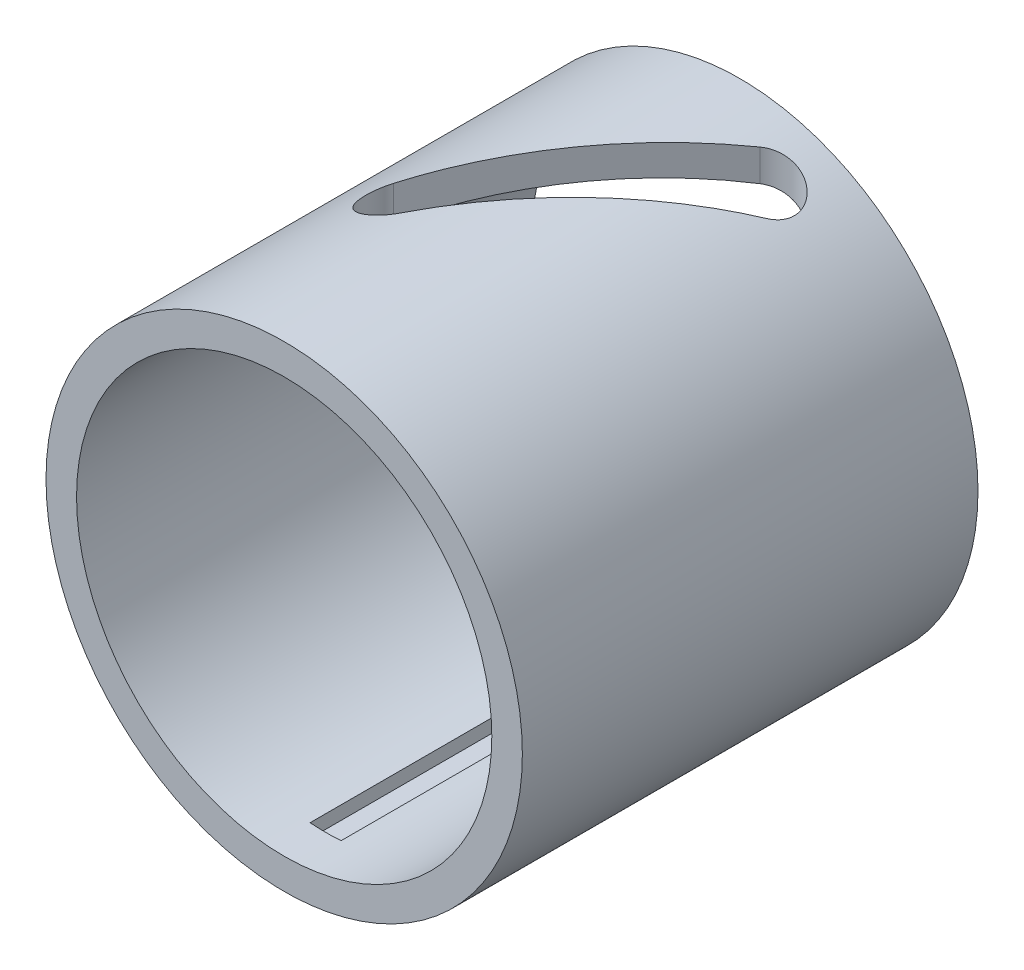
ISO-10303-21;
HEADER;
FILE_DESCRIPTION(('STEP AP214'),'2;1');
FILE_NAME('part.step','',(''),(''),'','','');
FILE_SCHEMA(('AUTOMOTIVE_DESIGN { 1 0 10303 214 1 1 1 1 }'));
ENDSEC;
DATA;
#1=APPLICATION_CONTEXT('core data for automotive mechanical design processes');
#2=APPLICATION_PROTOCOL_DEFINITION('international standard','automotive_design',2000,#1);
#3=PRODUCT_CONTEXT('',#1,'mechanical');
#4=PRODUCT('Part','Part','',(#3));
#5=PRODUCT_RELATED_PRODUCT_CATEGORY('part','',(#4));
#6=PRODUCT_DEFINITION_FORMATION('','',#4);
#7=PRODUCT_DEFINITION_CONTEXT('part definition',#1,'design');
#8=PRODUCT_DEFINITION('design','',#6,#7);
#9=PRODUCT_DEFINITION_SHAPE('','',#8);
#10=(LENGTH_UNIT() NAMED_UNIT(*) SI_UNIT(.MILLI.,.METRE.));
#11=(NAMED_UNIT(*) PLANE_ANGLE_UNIT() SI_UNIT($,.RADIAN.));
#12=(NAMED_UNIT(*) SI_UNIT($,.STERADIAN.) SOLID_ANGLE_UNIT());
#13=UNCERTAINTY_MEASURE_WITH_UNIT(LENGTH_MEASURE(1.E-05),#10,'distance_accuracy_value','');
#14=(GEOMETRIC_REPRESENTATION_CONTEXT(3) GLOBAL_UNCERTAINTY_ASSIGNED_CONTEXT((#13)) GLOBAL_UNIT_ASSIGNED_CONTEXT((#10,
#11,#12)) REPRESENTATION_CONTEXT('',''));
#15=CARTESIAN_POINT('',(0.,0.,0.));
#16=DIRECTION('',(0.,0.,1.));
#17=DIRECTION('',(1.,0.,0.));
#18=AXIS2_PLACEMENT_3D('',#15,#16,#17);
#19=CARTESIAN_POINT('',(0.,0.,44.));
#20=DIRECTION('',(0.,0.,-1.));
#21=DIRECTION('',(-1.,0.,0.));
#22=AXIS2_PLACEMENT_3D('',#19,#20,#21);
#23=CYLINDRICAL_SURFACE('',#22,20.05);
#24=CARTESIAN_POINT('',(0.,0.,44.));
#25=DIRECTION('',(0.,0.,1.));
#26=DIRECTION('',(1.,0.,0.));
#27=AXIS2_PLACEMENT_3D('',#24,#25,#26);
#28=CIRCLE('',#27,20.05);
#29=CARTESIAN_POINT('',(20.05,0.,44.));
#30=VERTEX_POINT('',#29);
#31=EDGE_CURVE('E193',#30,#30,#28,.T.);
#32=ORIENTED_EDGE('',*,*,#31,.T.);
#33=EDGE_LOOP('',(#32));
#34=FACE_BOUND('',#33,.T.);
#35=CARTESIAN_POINT('',(0.,0.,10.8478283437514));
#36=DIRECTION('',(0.756779205053716,0.,0.653670585844481));
#37=DIRECTION('',(0.653670585844481,0.,-0.756779205053716));
#38=AXIS2_PLACEMENT_3D('',#35,#36,#37);
#39=ELLIPSE('',#38,30.672942050922,20.05);
#40=CARTESIAN_POINT('',(5.93030233251377,19.1529113777771,3.98209263203964));
#41=VERTEX_POINT('',#40);
#42=CARTESIAN_POINT('',(-10.4709775628361,17.0985709601295,22.9704758174801));
#43=VERTEX_POINT('',#42);
#44=EDGE_CURVE('E171',#41,#43,#39,.T.);
#45=ORIENTED_EDGE('',*,*,#44,.T.);
#46=CARTESIAN_POINT('',(-10.4709775628361,17.0985709601295,22.9704758174801));
#47=CARTESIAN_POINT('',(-10.5203251715778,17.0683518600135,23.0276123028475));
#48=CARTESIAN_POINT('',(-10.5677396584952,17.0390209666357,23.0868628434022));
#49=CARTESIAN_POINT('',(-10.6583947564328,16.9824607441501,23.2094922146929));
#50=CARTESIAN_POINT('',(-10.7016323361369,16.9552329441547,23.2728739885555));
#51=CARTESIAN_POINT('',(-10.8249185600983,16.877000140305,23.4695823044986));
#52=CARTESIAN_POINT('',(-10.8980468059648,16.8297508635353,23.6089054553306));
#53=CARTESIAN_POINT('',(-11.0227523826062,16.7483456249599,23.9014314450786));
#54=CARTESIAN_POINT('',(-11.0742296069965,16.7142505420525,24.0546948562874));
#55=CARTESIAN_POINT('',(-11.1325711958885,16.6753974494036,24.2908879198746));
#56=CARTESIAN_POINT('',(-11.1488661865684,16.6644991762403,24.3705905133884));
#57=CARTESIAN_POINT('',(-11.174973944022,16.6470027686931,24.5315098998687));
#58=CARTESIAN_POINT('',(-11.1847873416341,16.6404042158283,24.6127265446847));
#59=CARTESIAN_POINT('',(-11.2029042945556,16.6282201462565,24.8414415409647));
#60=CARTESIAN_POINT('',(-11.2036981894854,16.6276823926632,24.989908073002));
#61=CARTESIAN_POINT('',(-11.1834483996578,16.6413071857435,25.2846493538103));
#62=CARTESIAN_POINT('',(-11.1623929168516,16.6554776744548,25.4309228751307));
#63=CARTESIAN_POINT('',(-11.1011745449738,16.6963374186882,25.7101878634728));
#64=CARTESIAN_POINT('',(-11.061954964607,16.7224078112492,25.8434804960682));
#65=CARTESIAN_POINT('',(-10.966631631379,16.7850745261113,26.1011813017534));
#66=CARTESIAN_POINT('',(-10.9105267775071,16.8216715347975,26.2255888948362));
#67=CARTESIAN_POINT('',(-10.7777967953571,16.9070500857724,26.4741652984793));
#68=CARTESIAN_POINT('',(-10.6997838735485,16.9566293382752,26.5973148201328));
#69=CARTESIAN_POINT('',(-10.5287534936932,17.0633530434454,26.8290274641264));
#70=CARTESIAN_POINT('',(-10.4357273927665,17.1205018503828,26.9375821180186));
#71=CARTESIAN_POINT('',(-10.2215554399939,17.2493538007786,27.1546859613682));
#72=CARTESIAN_POINT('',(-10.0982861493416,17.3219391345176,27.2606185148612));
#73=CARTESIAN_POINT('',(-9.83796456813808,17.4711048165308,27.4504471174158));
#74=CARTESIAN_POINT('',(-9.70090432684117,17.5476874569435,27.5343303527988));
#75=CARTESIAN_POINT('',(-9.39729136449156,17.7123372630864,27.6884086374601));
#76=CARTESIAN_POINT('',(-9.22921920359592,17.8006055602511,27.7554166818427));
#77=CARTESIAN_POINT('',(-8.88314209237513,17.9758164007182,27.8584019254089));
#78=CARTESIAN_POINT('',(-8.70513372321974,18.0627584744309,27.8943683729143));
#79=CARTESIAN_POINT('',(-8.3370833077581,18.2356282060896,27.9342781050479));
#80=CARTESIAN_POINT('',(-8.14683821346287,18.3214127526273,27.9370511645556));
#81=CARTESIAN_POINT('',(-7.86161085245654,18.4447402799961,27.913802806005));
#82=CARTESIAN_POINT('',(-7.76650536079663,18.4849788861642,27.9014708015325));
#83=CARTESIAN_POINT('',(-7.57712204406956,18.5634097171876,27.8675496604315));
#84=CARTESIAN_POINT('',(-7.48284381694852,18.6016029880873,27.8459653075829));
#85=CARTESIAN_POINT('',(-7.30106737670624,18.6736702905207,27.7949113396421));
#86=CARTESIAN_POINT('',(-7.2134789333852,18.7076662415949,27.7659333762081));
#87=CARTESIAN_POINT('',(-7.04065787790705,18.7733900905166,27.6996997663138));
#88=CARTESIAN_POINT('',(-6.95542410541423,18.805119118144,27.6624482817512));
#89=CARTESIAN_POINT('',(-6.78819858584106,18.8661276800203,27.5798259117999));
#90=CARTESIAN_POINT('',(-6.7062032759908,18.8954099480107,27.5344642707371));
#91=CARTESIAN_POINT('',(-6.54623755467705,18.9514236319261,27.4358401758082));
#92=CARTESIAN_POINT('',(-6.46826552048024,18.9781560800366,27.3825809414416));
#93=CARTESIAN_POINT('',(-6.3089209413293,19.0317581381685,27.2622400787994));
#94=CARTESIAN_POINT('',(-6.22810360639089,19.0583253082718,27.1942846672439));
#95=CARTESIAN_POINT('',(-6.07359491606944,19.1081287239675,27.0497214696143));
#96=CARTESIAN_POINT('',(-5.99989900399502,19.1313671041632,26.9731192851951));
#97=CARTESIAN_POINT('',(-5.93030233251377,19.1529113777771,26.892499332547));
#98=B_SPLINE_CURVE_WITH_KNOTS('',3,(#46,#47,#48,#49,#50,#51,#52,#53,#54,#55,#56,#57,#58,#59,#60,
#61,#62,#63,#64,#65,#66,#67,#68,#69,#70,#71,#72,#73,#74,#75,#76,#77,#78,#79,#80,#81,#82,#83,#84,
#85,#86,#87,#88,#89,#90,#91,#92,#93,#94,#95,#96,#97),.UNSPECIFIED.,.F.,.F.,(4,2,2,2,2,2,2,2,2,2,
2,2,2,2,2,2,2,2,2,2,2,2,2,2,2,4),(0.,0.243859018644434,0.487893704639131,0.978369218654151,
1.47108822391796,1.7169845932974,1.96285702662597,2.40573021982784,2.84884267658316,
3.27115513680617,3.69349514004102,4.15366049594782,4.61409171392185,5.14599589484831,
5.67820850507549,6.27945743572553,6.88091453362177,7.50351587026562,7.81516489524781,
8.12665298102852,8.42123211559666,8.71566339987046,9.00976119308319,9.30373942356481,
9.62975003512143,9.95555064577611),.UNSPECIFIED.);
#99=CARTESIAN_POINT('',(-5.93030233251377,19.1529113777771,26.892499332547));
#100=VERTEX_POINT('',#99);
#101=EDGE_CURVE('E183',#43,#100,#98,.T.);
#102=ORIENTED_EDGE('',*,*,#101,.T.);
#103=CARTESIAN_POINT('',(0.,0.,20.0267636208353));
#104=DIRECTION('',(-0.756779205053716,0.,-0.653670585844481));
#105=DIRECTION('',(0.653670585844481,0.,-0.756779205053716));
#106=AXIS2_PLACEMENT_3D('',#103,#104,#105);
#107=ELLIPSE('',#106,30.672942050922,20.05);
#108=CARTESIAN_POINT('',(10.4709775628361,17.0985709601295,7.90411614710653));
#109=VERTEX_POINT('',#108);
#110=EDGE_CURVE('E170',#100,#109,#107,.T.);
#111=ORIENTED_EDGE('',*,*,#110,.T.);
#112=CARTESIAN_POINT('',(10.4709775628361,17.0985709601295,7.90411614710653));
#113=CARTESIAN_POINT('',(10.5203251715778,17.0683518600135,7.84697966173917));
#114=CARTESIAN_POINT('',(10.5677396584952,17.0390209666357,7.78772912118442));
#115=CARTESIAN_POINT('',(10.6583947564328,16.9824607441501,7.66509974989369));
#116=CARTESIAN_POINT('',(10.7016323361369,16.9552329441547,7.60171797603111));
#117=CARTESIAN_POINT('',(10.8249185600983,16.877000140305,7.40500966008806));
#118=CARTESIAN_POINT('',(10.8980468059648,16.8297508635353,7.26568650925601));
#119=CARTESIAN_POINT('',(11.0227523826062,16.7483456249599,6.97316051950804));
#120=CARTESIAN_POINT('',(11.0742296069965,16.7142505420525,6.81989710829924));
#121=CARTESIAN_POINT('',(11.1325711958885,16.6753974494036,6.58370404471203));
#122=CARTESIAN_POINT('',(11.1488661865684,16.6644991762403,6.50400145119827));
#123=CARTESIAN_POINT('',(11.174973944022,16.6470027686931,6.34308206471796));
#124=CARTESIAN_POINT('',(11.1847873416341,16.6404042158283,6.26186541990188));
#125=CARTESIAN_POINT('',(11.2029042945556,16.6282201462565,6.03315042362188));
#126=CARTESIAN_POINT('',(11.2036981894854,16.6276823926632,5.88468389158467));
#127=CARTESIAN_POINT('',(11.1834483996578,16.6413071857435,5.58994261077628));
#128=CARTESIAN_POINT('',(11.1623929168516,16.6554776744548,5.44366908945592));
#129=CARTESIAN_POINT('',(11.1011745449738,16.6963374186882,5.16440410111383));
#130=CARTESIAN_POINT('',(11.061954964607,16.7224078112492,5.03111146851842));
#131=CARTESIAN_POINT('',(10.966631631379,16.7850745261113,4.7734106628332));
#132=CARTESIAN_POINT('',(10.9105267775071,16.8216715347975,4.64900306975046));
#133=CARTESIAN_POINT('',(10.7777967953571,16.9070500857724,4.40042666610731));
#134=CARTESIAN_POINT('',(10.6997838735485,16.9566293382752,4.27727714445385));
#135=CARTESIAN_POINT('',(10.5287534936933,17.0633530434454,4.04556450046021));
#136=CARTESIAN_POINT('',(10.4357273927665,17.1205018503828,3.93700984656799));
#137=CARTESIAN_POINT('',(10.2215554399939,17.2493538007786,3.71990600321847));
#138=CARTESIAN_POINT('',(10.0982861493416,17.3219391345176,3.61397344972539));
#139=CARTESIAN_POINT('',(9.8379645681381,17.4711048165308,3.42414484717079));
#140=CARTESIAN_POINT('',(9.70090432684118,17.5476874569435,3.34026161178784));
#141=CARTESIAN_POINT('',(9.39729136449157,17.7123372630863,3.18618332712651));
#142=CARTESIAN_POINT('',(9.22921920359594,17.8006055602511,3.11917528274391));
#143=CARTESIAN_POINT('',(8.88314209237514,17.9758164007181,3.01619003917772));
#144=CARTESIAN_POINT('',(8.70513372321975,18.0627584744309,2.98022359167235));
#145=CARTESIAN_POINT('',(8.33708330775811,18.2356282060896,2.94031385953874));
#146=CARTESIAN_POINT('',(8.14683821346289,18.3214127526273,2.937540800031));
#147=CARTESIAN_POINT('',(7.86161085245656,18.4447402799961,2.96078915858166));
#148=CARTESIAN_POINT('',(7.76650536079665,18.4849788861642,2.97312116305408));
#149=CARTESIAN_POINT('',(7.57712204406957,18.5634097171876,3.00704230415515));
#150=CARTESIAN_POINT('',(7.48284381694854,18.6016029880873,3.02862665700376));
#151=CARTESIAN_POINT('',(7.30106737670625,18.6736702905207,3.07968062494453));
#152=CARTESIAN_POINT('',(7.21347893338521,18.7076662415949,3.10865858837855));
#153=CARTESIAN_POINT('',(7.04065787790707,18.7733900905166,3.17489219827287));
#154=CARTESIAN_POINT('',(6.95542410541424,18.805119118144,3.21214368283546));
#155=CARTESIAN_POINT('',(6.78819858584107,18.8661276800203,3.29476605278667));
#156=CARTESIAN_POINT('',(6.70620327599081,18.8954099480107,3.34012769384956));
#157=CARTESIAN_POINT('',(6.54623755467706,18.9514236319261,3.4387517887784));
#158=CARTESIAN_POINT('',(6.46826552048025,18.9781560800366,3.49201102314498));
#159=CARTESIAN_POINT('',(6.30892094132931,19.0317581381685,3.61235188578722));
#160=CARTESIAN_POINT('',(6.2281036063909,19.0583253082718,3.68030729734268));
#161=CARTESIAN_POINT('',(6.07359491606945,19.1081287239675,3.82487049497234));
#162=CARTESIAN_POINT('',(5.99989900399502,19.1313671041632,3.90147267939154));
#163=CARTESIAN_POINT('',(5.93030233251378,19.1529113777771,3.98209263203964));
#164=B_SPLINE_CURVE_WITH_KNOTS('',3,(#112,#113,#114,#115,#116,#117,#118,#119,#120,#121,#122,
#123,#124,#125,#126,#127,#128,#129,#130,#131,#132,#133,#134,#135,#136,#137,#138,#139,#140,#141,
#142,#143,#144,#145,#146,#147,#148,#149,#150,#151,#152,#153,#154,#155,#156,#157,#158,#159,#160,
#161,#162,#163),.UNSPECIFIED.,.F.,.F.,(4,2,2,2,2,2,2,2,2,2,2,2,2,2,2,2,2,2,2,2,2,2,2,2,2,4),(0.,
0.243859018644437,0.487893704639133,0.978369218654152,1.47108822391796,1.7169845932974,
1.96285702662598,2.40573021982785,2.84884267658317,3.27115513680617,3.69349514004102,
4.15366049594783,4.61409171392186,5.14599589484831,5.67820850507549,6.27945743572553,
6.88091453362177,7.50351587026562,7.81516489524781,8.12665298102853,8.42123211559666,
8.71566339987047,9.00976119308319,9.30373942356482,9.62975003512144,9.95555064577612),.UNSPECIFIED.);
#165=EDGE_CURVE('E162',#109,#41,#164,.T.);
#166=ORIENTED_EDGE('',*,*,#165,.T.);
#167=EDGE_LOOP('',(#45,#102,#111,#166));
#168=FACE_BOUND('',#167,.T.);
#169=CARTESIAN_POINT('',(0.,0.,0.));
#170=DIRECTION('',(0.,0.,1.));
#171=DIRECTION('',(1.,0.,0.));
#172=AXIS2_PLACEMENT_3D('',#169,#170,#171);
#173=CIRCLE('',#172,20.05);
#174=CARTESIAN_POINT('',(1.5,-19.9938115425749,0.));
#175=VERTEX_POINT('',#174);
#176=CARTESIAN_POINT('',(-1.5,-19.9938115425749,0.));
#177=VERTEX_POINT('',#176);
#178=EDGE_CURVE('E192',#175,#177,#173,.T.);
#179=ORIENTED_EDGE('',*,*,#178,.F.);
#180=DIRECTION('',(0.,0.,-1.));
#181=VECTOR('',#180,1.);
#182=CARTESIAN_POINT('',(1.5,-19.9938115425749,44.));
#183=LINE('',#182,#181);
#184=CARTESIAN_POINT('',(1.5,-19.9938115425749,40.));
#185=VERTEX_POINT('',#184);
#186=EDGE_CURVE('E128',#175,#185,#183,.F.);
#187=ORIENTED_EDGE('',*,*,#186,.T.);
#188=CARTESIAN_POINT('',(0.,0.,40.));
#189=DIRECTION('',(0.,0.,-1.));
#190=DIRECTION('',(-1.,0.,0.));
#191=AXIS2_PLACEMENT_3D('',#188,#189,#190);
#192=CIRCLE('',#191,20.05);
#193=CARTESIAN_POINT('',(-1.5,-19.9938115425749,40.));
#194=VERTEX_POINT('',#193);
#195=EDGE_CURVE('E11',#185,#194,#192,.T.);
#196=ORIENTED_EDGE('',*,*,#195,.T.);
#197=DIRECTION('',(0.,0.,-1.));
#198=VECTOR('',#197,1.);
#199=CARTESIAN_POINT('',(-1.5,-19.9938115425749,44.));
#200=LINE('',#199,#198);
#201=EDGE_CURVE('E105',#194,#177,#200,.T.);
#202=ORIENTED_EDGE('',*,*,#201,.T.);
#203=EDGE_LOOP('',(#179,#187,#196,#202));
#204=FACE_BOUND('',#203,.T.);
#205=ADVANCED_FACE('F33',(#34,#168,#204),#23,.F.);
#206=CARTESIAN_POINT('',(0.,0.,0.));
#207=DIRECTION('',(0.,0.,1.));
#208=DIRECTION('',(1.,0.,0.));
#209=AXIS2_PLACEMENT_3D('',#206,#207,#208);
#210=PLANE('',#209);
#211=CARTESIAN_POINT('',(0.,0.,0.));
#212=DIRECTION('',(0.,0.,1.));
#213=DIRECTION('',(1.,0.,0.));
#214=AXIS2_PLACEMENT_3D('',#211,#212,#213);
#215=CIRCLE('',#214,23.);
#216=CARTESIAN_POINT('',(23.,0.,0.));
#217=VERTEX_POINT('',#216);
#218=EDGE_CURVE('E197',#217,#217,#215,.T.);
#219=ORIENTED_EDGE('',*,*,#218,.F.);
#220=EDGE_LOOP('',(#219));
#221=FACE_BOUND('',#220,.T.);
#222=DIRECTION('',(0.,1.,0.));
#223=VECTOR('',#222,1.);
#224=CARTESIAN_POINT('',(1.5,-21.3,0.));
#225=LINE('',#224,#223);
#226=CARTESIAN_POINT('',(1.5,-21.3,0.));
#227=VERTEX_POINT('',#226);
#228=EDGE_CURVE('E49',#227,#175,#225,.T.);
#229=ORIENTED_EDGE('',*,*,#228,.T.);
#230=ORIENTED_EDGE('',*,*,#178,.T.);
#231=DIRECTION('',(0.,1.,0.));
#232=VECTOR('',#231,1.);
#233=CARTESIAN_POINT('',(-1.5,0.,0.));
#234=LINE('',#233,#232);
#235=CARTESIAN_POINT('',(-1.5,-21.3,0.));
#236=VERTEX_POINT('',#235);
#237=EDGE_CURVE('E42',#236,#177,#234,.T.);
#238=ORIENTED_EDGE('',*,*,#237,.F.);
#239=DIRECTION('',(1.,0.,0.));
#240=VECTOR('',#239,1.);
#241=CARTESIAN_POINT('',(-1.5,-21.3,0.));
#242=LINE('',#241,#240);
#243=EDGE_CURVE('E114',#236,#227,#242,.T.);
#244=ORIENTED_EDGE('',*,*,#243,.T.);
#245=EDGE_LOOP('',(#229,#230,#238,#244));
#246=FACE_BOUND('',#245,.T.);
#247=ADVANCED_FACE('F177',(#221,#246),#210,.F.);
#248=CARTESIAN_POINT('',(0.,0.,44.));
#249=DIRECTION('',(0.,0.,-1.));
#250=DIRECTION('',(-1.,0.,0.));
#251=AXIS2_PLACEMENT_3D('',#248,#249,#250);
#252=CYLINDRICAL_SURFACE('',#251,23.);
#253=ORIENTED_EDGE('',*,*,#218,.T.);
#254=EDGE_LOOP('',(#253));
#255=FACE_BOUND('',#254,.T.);
#256=CARTESIAN_POINT('',(0.,0.,44.));
#257=DIRECTION('',(0.,0.,1.));
#258=DIRECTION('',(1.,0.,0.));
#259=AXIS2_PLACEMENT_3D('',#256,#257,#258);
#260=CIRCLE('',#259,23.);
#261=CARTESIAN_POINT('',(23.,0.,44.));
#262=VERTEX_POINT('',#261);
#263=EDGE_CURVE('E200',#262,#262,#260,.T.);
#264=ORIENTED_EDGE('',*,*,#263,.F.);
#265=EDGE_LOOP('',(#264));
#266=FACE_BOUND('',#265,.T.);
#267=CARTESIAN_POINT('',(-10.4709775628361,20.4782477003913,22.9704758174801));
#268=CARTESIAN_POINT('',(-10.5216933489736,20.4523161016633,23.029197208829));
#269=CARTESIAN_POINT('',(-10.5703009359283,20.4272237531741,23.0900747332213));
#270=CARTESIAN_POINT('',(-10.662981821202,20.3789976273674,23.2159707916252));
#271=CARTESIAN_POINT('',(-10.707052709194,20.3558648923272,23.2809914974933));
#272=CARTESIAN_POINT('',(-10.8321370809536,20.2897443351438,23.4822870068867));
#273=CARTESIAN_POINT('',(-10.9057361274554,20.2501817772265,23.6244662020593));
#274=CARTESIAN_POINT('',(-11.0301760554913,20.1826731444027,23.9216477468732));
#275=CARTESIAN_POINT('',(-11.0809374264601,20.1547676780081,24.076692704615));
#276=CARTESIAN_POINT('',(-11.1566918957679,20.1129345404651,24.3945117465327));
#277=CARTESIAN_POINT('',(-11.1817402890325,20.0989768767426,24.5572684543969));
#278=CARTESIAN_POINT('',(-11.2039641993443,20.0865956258391,24.8735064192824));
#279=CARTESIAN_POINT('',(-11.2030050498001,20.0871324417345,25.0268185434398));
#280=CARTESIAN_POINT('',(-11.1778358641959,20.1011489364019,25.3309798301754));
#281=CARTESIAN_POINT('',(-11.1536161218092,20.1146340183074,25.4818279378276));
#282=CARTESIAN_POINT('',(-11.0841821762107,20.152974928484,25.7722158518303));
#283=CARTESIAN_POINT('',(-11.0396134591217,20.1774808322306,25.9119585144175));
#284=CARTESIAN_POINT('',(-10.9315892633147,20.2362080732125,26.1817025620406));
#285=CARTESIAN_POINT('',(-10.8681325097891,20.2704300662071,26.311703288824));
#286=CARTESIAN_POINT('',(-10.7195232101655,20.349431441716,26.5681585080753));
#287=CARTESIAN_POINT('',(-10.6331697494972,20.3947790678279,26.6937393246387));
#288=CARTESIAN_POINT('',(-10.444092516966,20.4922484023868,26.9289151855086));
#289=CARTESIAN_POINT('',(-10.3413607537429,20.5443734153787,27.038502375892));
#290=CARTESIAN_POINT('',(-10.109509697135,20.6595352204707,27.2517865579422));
#291=CARTESIAN_POINT('',(-9.97871458199763,20.7231375592366,27.3533581984711));
#292=CARTESIAN_POINT('',(-9.70337598602932,20.8534822034451,27.5331895202454));
#293=CARTESIAN_POINT('',(-9.55882637488675,20.9202259022157,27.6114387419914));
#294=CARTESIAN_POINT('',(-9.24575641482212,21.0605777183552,27.7492038762734));
#295=CARTESIAN_POINT('',(-9.07624899512261,21.1342644306343,27.8064090564046));
#296=CARTESIAN_POINT('',(-8.72908439599452,21.2800032494132,27.8899727986438));
#297=CARTESIAN_POINT('',(-8.55142568914597,21.3520550457446,27.9163255547702));
#298=CARTESIAN_POINT('',(-8.18949758873681,21.4934989570384,27.9370295103008));
#299=CARTESIAN_POINT('',(-8.0051668560311,21.562821602326,27.9308071630796));
#300=CARTESIAN_POINT('',(-7.6386267627921,21.6953767097845,27.8841604720372));
#301=CARTESIAN_POINT('',(-7.45641722082899,21.7586096962313,27.8437390754462));
#302=CARTESIAN_POINT('',(-7.10818773498001,21.8747760701716,27.7312146513382));
#303=CARTESIAN_POINT('',(-6.94180818575916,21.9280410031262,27.6605897063336));
#304=CARTESIAN_POINT('',(-6.70269760047383,22.0018380274415,27.5323301789675));
#305=CARTESIAN_POINT('',(-6.62474707652983,22.0254175167107,27.4858644807633));
#306=CARTESIAN_POINT('',(-6.47297630397109,22.0704966054348,27.3857546339428));
#307=CARTESIAN_POINT('',(-6.39915432933954,22.0919970768442,27.3321135174422));
#308=CARTESIAN_POINT('',(-6.25613726906997,22.1329234390614,27.2178192542061));
#309=CARTESIAN_POINT('',(-6.18695746007338,22.1523425948647,27.1571445918868));
#310=CARTESIAN_POINT('',(-6.05425032566043,22.1889793509901,27.0294632899326));
#311=CARTESIAN_POINT('',(-5.99071606131643,22.2061996656124,26.9624646380864));
#312=CARTESIAN_POINT('',(-5.93030233251377,22.2223201814073,26.892499332547));
#313=B_SPLINE_CURVE_WITH_KNOTS('',3,(#267,#268,#269,#270,#271,#272,#273,#274,#275,#276,#277,
#278,#279,#280,#281,#282,#283,#284,#285,#286,#287,#288,#289,#290,#291,#292,#293,#294,#295,#296,
#297,#298,#299,#300,#301,#302,#303,#304,#305,#306,#307,#308,#309,#310,#311,#312),.UNSPECIFIED.,
.F.,.F.,(4,2,2,2,2,2,2,2,2,2,2,2,2,2,2,2,2,2,2,2,2,2,4),(0.,0.245308598046165,0.490746861947432,
0.982988573590146,1.47693103432992,1.96980904838986,2.42743661765847,2.88525523165414,
3.32946466083193,3.77370407777009,4.24880326471548,4.72413497723539,5.25410977337282,
5.78432189304616,6.36210624296025,6.93999930609493,7.5281011255113,8.1161522682296,
8.67823180794868,8.95919523620433,9.24004031063721,9.521768361526,9.80314520776706),.UNSPECIFIED.);
#314=CARTESIAN_POINT('',(-10.4709775628361,20.4782477003913,22.9704758174801));
#315=VERTEX_POINT('',#314);
#316=CARTESIAN_POINT('',(-5.93030233251377,22.2223201814073,26.892499332547));
#317=VERTEX_POINT('',#316);
#318=EDGE_CURVE('E194',#315,#317,#313,.T.);
#319=ORIENTED_EDGE('',*,*,#318,.F.);
#320=CARTESIAN_POINT('',(0.,0.,10.8478283437514));
#321=DIRECTION('',(0.756779205053716,0.,0.653670585844481));
#322=DIRECTION('',(0.653670585844481,0.,-0.756779205053716));
#323=AXIS2_PLACEMENT_3D('',#320,#321,#322);
#324=ELLIPSE('',#323,35.1859185621549,23.);
#325=CARTESIAN_POINT('',(5.93030233251377,22.2223201814073,3.98209263203964));
#326=VERTEX_POINT('',#325);
#327=EDGE_CURVE('E140',#326,#315,#324,.T.);
#328=ORIENTED_EDGE('',*,*,#327,.F.);
#329=CARTESIAN_POINT('',(10.4709775628361,20.4782477003913,7.90411614710653));
#330=CARTESIAN_POINT('',(10.5216933489736,20.4523161016633,7.84539475575765));
#331=CARTESIAN_POINT('',(10.5703009359283,20.4272237531741,7.78451723136536));
#332=CARTESIAN_POINT('',(10.662981821202,20.3789976273674,7.65862117296145));
#333=CARTESIAN_POINT('',(10.707052709194,20.3558648923272,7.59360046709337));
#334=CARTESIAN_POINT('',(10.8321370809536,20.2897443351438,7.39230495769995));
#335=CARTESIAN_POINT('',(10.9057361274554,20.2501817772265,7.25012576252731));
#336=CARTESIAN_POINT('',(11.0301760554913,20.1826731444027,6.95294421771344));
#337=CARTESIAN_POINT('',(11.0809374264601,20.1547676780081,6.79789925997159));
#338=CARTESIAN_POINT('',(11.1566918957679,20.1129345404651,6.48008021805391));
#339=CARTESIAN_POINT('',(11.1817402890325,20.0989768767426,6.31732351018972));
#340=CARTESIAN_POINT('',(11.2039641993443,20.0865956258391,6.0010855453042));
#341=CARTESIAN_POINT('',(11.2030050498001,20.0871324417345,5.84777342114678));
#342=CARTESIAN_POINT('',(11.1778358641959,20.1011489364019,5.54361213441118));
#343=CARTESIAN_POINT('',(11.1536161218092,20.1146340183074,5.39276402675903));
#344=CARTESIAN_POINT('',(11.0841821762107,20.152974928484,5.10237611275627));
#345=CARTESIAN_POINT('',(11.0396134591218,20.1774808322306,4.96263345016911));
#346=CARTESIAN_POINT('',(10.9315892633147,20.2362080732125,4.69288940254603));
#347=CARTESIAN_POINT('',(10.8681325097891,20.2704300662071,4.56288867576267));
#348=CARTESIAN_POINT('',(10.7195232101655,20.349431441716,4.30643345651131));
#349=CARTESIAN_POINT('',(10.6331697494972,20.3947790678279,4.18085263994789));
#350=CARTESIAN_POINT('',(10.444092516966,20.4922484023868,3.94567677907801));
#351=CARTESIAN_POINT('',(10.3413607537429,20.5443734153787,3.83608958869462));
#352=CARTESIAN_POINT('',(10.109509697135,20.6595352204707,3.62280540664438));
#353=CARTESIAN_POINT('',(9.97871458199764,20.7231375592366,3.52123376611548));
#354=CARTESIAN_POINT('',(9.70337598602933,20.853482203445,3.34140244434124));
#355=CARTESIAN_POINT('',(9.55882637488676,20.9202259022157,3.26315322259521));
#356=CARTESIAN_POINT('',(9.24575641482213,21.0605777183552,3.12538808831321));
#357=CARTESIAN_POINT('',(9.07624899512262,21.1342644306343,3.06818290818198));
#358=CARTESIAN_POINT('',(8.72908439599453,21.2800032494132,2.98461916594277));
#359=CARTESIAN_POINT('',(8.55142568914598,21.3520550457446,2.95826640981642));
#360=CARTESIAN_POINT('',(8.18949758873682,21.4934989570384,2.9375624542858));
#361=CARTESIAN_POINT('',(8.00516685603112,21.562821602326,2.94378480150706));
#362=CARTESIAN_POINT('',(7.63862676279211,21.6953767097845,2.99043149254943));
#363=CARTESIAN_POINT('',(7.456417220829,21.7586096962313,3.03085288914037));
#364=CARTESIAN_POINT('',(7.10818773498002,21.8747760701716,3.14337731324844));
#365=CARTESIAN_POINT('',(6.94180818575917,21.9280410031262,3.21400225825298));
#366=CARTESIAN_POINT('',(6.70269760047384,22.0018380274415,3.34226178561917));
#367=CARTESIAN_POINT('',(6.62474707652984,22.0254175167107,3.38872748382334));
#368=CARTESIAN_POINT('',(6.4729763039711,22.0704966054348,3.48883733064385));
#369=CARTESIAN_POINT('',(6.39915432933955,22.0919970768442,3.54247844714445));
#370=CARTESIAN_POINT('',(6.25613726906998,22.1329234390614,3.6567727103805));
#371=CARTESIAN_POINT('',(6.18695746007338,22.1523425948647,3.71744737269985));
#372=CARTESIAN_POINT('',(6.05425032566044,22.1889793509901,3.84512867465404));
#373=CARTESIAN_POINT('',(5.99071606131644,22.2061996656124,3.91212732650023));
#374=CARTESIAN_POINT('',(5.93030233251378,22.2223201814073,3.98209263203964));
#375=B_SPLINE_CURVE_WITH_KNOTS('',3,(#329,#330,#331,#332,#333,#334,#335,#336,#337,#338,#339,
#340,#341,#342,#343,#344,#345,#346,#347,#348,#349,#350,#351,#352,#353,#354,#355,#356,#357,#358,
#359,#360,#361,#362,#363,#364,#365,#366,#367,#368,#369,#370,#371,#372,#373,#374),.UNSPECIFIED.,
.F.,.F.,(4,2,2,2,2,2,2,2,2,2,2,2,2,2,2,2,2,2,2,2,2,2,4),(0.,0.245308598046166,0.490746861947433,
0.982988573590149,1.47693103432992,1.96980904838986,2.42743661765848,2.88525523165414,
3.32946466083193,3.77370407777009,4.24880326471549,4.72413497723539,5.25410977337282,
5.78432189304616,6.36210624296026,6.93999930609494,7.5281011255113,8.1161522682296,
8.67823180794868,8.95919523620433,9.24004031063721,9.52176836152601,9.80314520776707),.UNSPECIFIED.);
#376=CARTESIAN_POINT('',(10.4709775628361,20.4782477003913,7.90411614710653));
#377=VERTEX_POINT('',#376);
#378=EDGE_CURVE('E142',#377,#326,#375,.T.);
#379=ORIENTED_EDGE('',*,*,#378,.F.);
#380=CARTESIAN_POINT('',(0.,0.,20.0267636208353));
#381=DIRECTION('',(-0.756779205053716,0.,-0.653670585844481));
#382=DIRECTION('',(0.653670585844481,0.,-0.756779205053716));
#383=AXIS2_PLACEMENT_3D('',#380,#381,#382);
#384=ELLIPSE('',#383,35.1859185621549,23.);
#385=EDGE_CURVE('E148',#317,#377,#384,.T.);
#386=ORIENTED_EDGE('',*,*,#385,.F.);
#387=EDGE_LOOP('',(#319,#328,#379,#386));
#388=FACE_BOUND('',#387,.T.);
#389=ADVANCED_FACE('F35',(#255,#266,#388),#252,.T.);
#390=CARTESIAN_POINT('',(0.,0.,44.));
#391=DIRECTION('',(0.,0.,1.));
#392=DIRECTION('',(1.,0.,0.));
#393=AXIS2_PLACEMENT_3D('',#390,#391,#392);
#394=PLANE('',#393);
#395=ORIENTED_EDGE('',*,*,#263,.T.);
#396=EDGE_LOOP('',(#395));
#397=FACE_BOUND('',#396,.T.);
#398=ORIENTED_EDGE('',*,*,#31,.F.);
#399=EDGE_LOOP('',(#398));
#400=FACE_BOUND('',#399,.T.);
#401=ADVANCED_FACE('F181',(#397,#400),#394,.T.);
#402=CARTESIAN_POINT('',(-8.20063994767492,40.,24.9314875750135));
#403=DIRECTION('',(0.,-1.,0.));
#404=DIRECTION('',(0.,0.,-1.));
#405=AXIS2_PLACEMENT_3D('',#402,#403,#404);
#406=CYLINDRICAL_SURFACE('',#405,3.);
#407=ORIENTED_EDGE('',*,*,#318,.T.);
#408=DIRECTION('',(0.,-1.,0.));
#409=VECTOR('',#408,1.);
#410=CARTESIAN_POINT('',(-5.93030233251377,40.,26.892499332547));
#411=LINE('',#410,#409);
#412=EDGE_CURVE('E137',#317,#100,#411,.T.);
#413=ORIENTED_EDGE('',*,*,#412,.T.);
#414=ORIENTED_EDGE('',*,*,#101,.F.);
#415=DIRECTION('',(0.,-1.,0.));
#416=VECTOR('',#415,1.);
#417=CARTESIAN_POINT('',(-10.4709775628361,40.,22.9704758174801));
#418=LINE('',#417,#416);
#419=EDGE_CURVE('E131',#315,#43,#418,.T.);
#420=ORIENTED_EDGE('',*,*,#419,.F.);
#421=EDGE_LOOP('',(#407,#413,#414,#420));
#422=FACE_BOUND('',#421,.T.);
#423=ADVANCED_FACE('F179',(#422),#406,.F.);
#424=CARTESIAN_POINT('',(-5.93030233251377,40.,26.892499332547));
#425=DIRECTION('',(-0.756779205053716,0.,-0.653670585844481));
#426=DIRECTION('',(-0.653670585844481,0.,0.756779205053716));
#427=AXIS2_PLACEMENT_3D('',#424,#425,#426);
#428=PLANE('',#427);
#429=ORIENTED_EDGE('',*,*,#385,.T.);
#430=DIRECTION('',(0.,-1.,0.));
#431=VECTOR('',#430,1.);
#432=CARTESIAN_POINT('',(10.4709775628361,40.,7.90411614710653));
#433=LINE('',#432,#431);
#434=EDGE_CURVE('E134',#377,#109,#433,.T.);
#435=ORIENTED_EDGE('',*,*,#434,.T.);
#436=ORIENTED_EDGE('',*,*,#110,.F.);
#437=ORIENTED_EDGE('',*,*,#412,.F.);
#438=EDGE_LOOP('',(#429,#435,#436,#437));
#439=FACE_BOUND('',#438,.T.);
#440=ADVANCED_FACE('F156',(#439),#428,.T.);
#441=CARTESIAN_POINT('',(8.20063994767493,40.,5.94310438957308));
#442=DIRECTION('',(0.,-1.,0.));
#443=DIRECTION('',(0.,0.,-1.));
#444=AXIS2_PLACEMENT_3D('',#441,#442,#443);
#445=CYLINDRICAL_SURFACE('',#444,3.);
#446=ORIENTED_EDGE('',*,*,#378,.T.);
#447=DIRECTION('',(0.,-1.,0.));
#448=VECTOR('',#447,1.);
#449=CARTESIAN_POINT('',(5.93030233251377,40.,3.98209263203964));
#450=LINE('',#449,#448);
#451=EDGE_CURVE('E57',#326,#41,#450,.T.);
#452=ORIENTED_EDGE('',*,*,#451,.T.);
#453=ORIENTED_EDGE('',*,*,#165,.F.);
#454=ORIENTED_EDGE('',*,*,#434,.F.);
#455=EDGE_LOOP('',(#446,#452,#453,#454));
#456=FACE_BOUND('',#455,.T.);
#457=ADVANCED_FACE('F150',(#456),#445,.F.);
#458=CARTESIAN_POINT('',(-10.4709775628361,40.,22.9704758174801));
#459=DIRECTION('',(0.756779205053716,0.,0.653670585844481));
#460=DIRECTION('',(0.653670585844481,0.,-0.756779205053716));
#461=AXIS2_PLACEMENT_3D('',#458,#459,#460);
#462=PLANE('',#461);
#463=ORIENTED_EDGE('',*,*,#327,.T.);
#464=ORIENTED_EDGE('',*,*,#419,.T.);
#465=ORIENTED_EDGE('',*,*,#44,.F.);
#466=ORIENTED_EDGE('',*,*,#451,.F.);
#467=EDGE_LOOP('',(#463,#464,#465,#466));
#468=FACE_BOUND('',#467,.T.);
#469=ADVANCED_FACE('F155',(#468),#462,.T.);
#470=CARTESIAN_POINT('',(1.5,-21.3,40.));
#471=DIRECTION('',(-1.,0.,0.));
#472=DIRECTION('',(0.,0.,1.));
#473=AXIS2_PLACEMENT_3D('',#470,#471,#472);
#474=PLANE('',#473);
#475=ORIENTED_EDGE('',*,*,#228,.F.);
#476=DIRECTION('',(0.,0.,-1.));
#477=VECTOR('',#476,1.);
#478=CARTESIAN_POINT('',(1.5,-21.3,40.));
#479=LINE('',#478,#477);
#480=CARTESIAN_POINT('',(1.5,-21.3,40.));
#481=VERTEX_POINT('',#480);
#482=EDGE_CURVE('E116',#481,#227,#479,.T.);
#483=ORIENTED_EDGE('',*,*,#482,.F.);
#484=DIRECTION('',(0.,1.,0.));
#485=VECTOR('',#484,1.);
#486=CARTESIAN_POINT('',(1.5,-21.3,40.));
#487=LINE('',#486,#485);
#488=EDGE_CURVE('E109',#481,#185,#487,.T.);
#489=ORIENTED_EDGE('',*,*,#488,.T.);
#490=ORIENTED_EDGE('',*,*,#186,.F.);
#491=EDGE_LOOP('',(#475,#483,#489,#490));
#492=FACE_BOUND('',#491,.T.);
#493=ADVANCED_FACE('F250',(#492),#474,.T.);
#494=CARTESIAN_POINT('',(-1.5,-21.3,40.));
#495=DIRECTION('',(1.,0.,0.));
#496=DIRECTION('',(0.,0.,-1.));
#497=AXIS2_PLACEMENT_3D('',#494,#495,#496);
#498=PLANE('',#497);
#499=DIRECTION('',(0.,-1.,0.));
#500=VECTOR('',#499,1.);
#501=CARTESIAN_POINT('',(-1.5,-21.3,40.));
#502=LINE('',#501,#500);
#503=CARTESIAN_POINT('',(-1.5,-21.3,40.));
#504=VERTEX_POINT('',#503);
#505=EDGE_CURVE('E99',#194,#504,#502,.T.);
#506=ORIENTED_EDGE('',*,*,#505,.T.);
#507=DIRECTION('',(0.,0.,-1.));
#508=VECTOR('',#507,1.);
#509=CARTESIAN_POINT('',(-1.5,-21.3,40.));
#510=LINE('',#509,#508);
#511=EDGE_CURVE('E102',#504,#236,#510,.T.);
#512=ORIENTED_EDGE('',*,*,#511,.T.);
#513=ORIENTED_EDGE('',*,*,#237,.T.);
#514=ORIENTED_EDGE('',*,*,#201,.F.);
#515=EDGE_LOOP('',(#506,#512,#513,#514));
#516=FACE_BOUND('',#515,.T.);
#517=ADVANCED_FACE('F101',(#516),#498,.T.);
#518=CARTESIAN_POINT('',(-1.5,-21.3,40.));
#519=DIRECTION('',(0.,1.,0.));
#520=DIRECTION('',(0.,0.,1.));
#521=AXIS2_PLACEMENT_3D('',#518,#519,#520);
#522=PLANE('',#521);
#523=ORIENTED_EDGE('',*,*,#243,.F.);
#524=ORIENTED_EDGE('',*,*,#511,.F.);
#525=DIRECTION('',(1.,0.,0.));
#526=VECTOR('',#525,1.);
#527=CARTESIAN_POINT('',(-1.5,-21.3,40.));
#528=LINE('',#527,#526);
#529=EDGE_CURVE('E108',#504,#481,#528,.T.);
#530=ORIENTED_EDGE('',*,*,#529,.T.);
#531=ORIENTED_EDGE('',*,*,#482,.T.);
#532=EDGE_LOOP('',(#523,#524,#530,#531));
#533=FACE_BOUND('',#532,.T.);
#534=ADVANCED_FACE('F112',(#533),#522,.T.);
#535=CARTESIAN_POINT('',(0.,0.,40.));
#536=DIRECTION('',(0.,0.,-1.));
#537=DIRECTION('',(-1.,0.,0.));
#538=AXIS2_PLACEMENT_3D('',#535,#536,#537);
#539=PLANE('',#538);
#540=ORIENTED_EDGE('',*,*,#488,.F.);
#541=ORIENTED_EDGE('',*,*,#529,.F.);
#542=ORIENTED_EDGE('',*,*,#505,.F.);
#543=ORIENTED_EDGE('',*,*,#195,.F.);
#544=EDGE_LOOP('',(#540,#541,#542,#543));
#545=FACE_BOUND('',#544,.T.);
#546=ADVANCED_FACE('F119',(#545),#539,.T.);
#547=CLOSED_SHELL('',(#205,#247,#389,#401,#423,#440,#457,#469,#493,#517,#534,#546));
#548=MANIFOLD_SOLID_BREP('B2',#547);
#549=ADVANCED_BREP_SHAPE_REPRESENTATION('',(#18,#548),#14);
#550=SHAPE_DEFINITION_REPRESENTATION(#9,#549);
ENDSEC;
END-ISO-10303-21;
